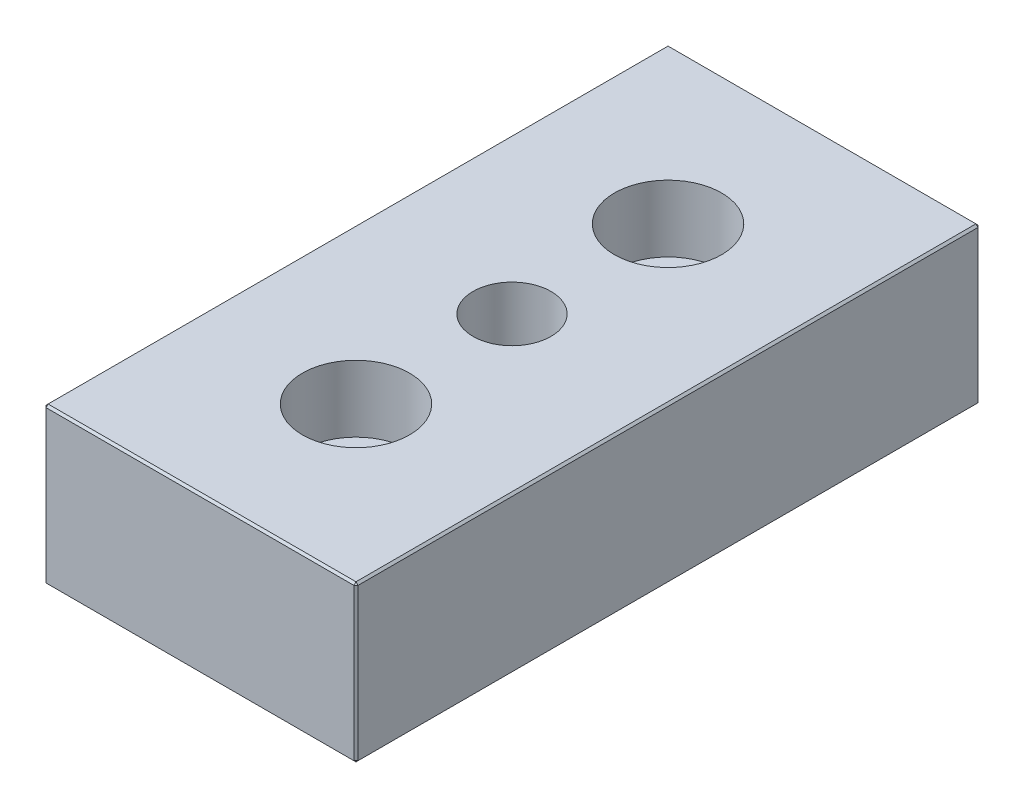
ISO-10303-21;
HEADER;
FILE_DESCRIPTION(('STEP AP214'),'2;1');
FILE_NAME('part.step','',(''),(''),'','','');
FILE_SCHEMA(('AUTOMOTIVE_DESIGN { 1 0 10303 214 1 1 1 1 }'));
ENDSEC;
DATA;
#1=APPLICATION_CONTEXT('core data for automotive mechanical design processes');
#2=APPLICATION_PROTOCOL_DEFINITION('international standard','automotive_design',2000,#1);
#3=PRODUCT_CONTEXT('',#1,'mechanical');
#4=PRODUCT('Part','Part','',(#3));
#5=PRODUCT_RELATED_PRODUCT_CATEGORY('part','',(#4));
#6=PRODUCT_DEFINITION_FORMATION('','',#4);
#7=PRODUCT_DEFINITION_CONTEXT('part definition',#1,'design');
#8=PRODUCT_DEFINITION('design','',#6,#7);
#9=PRODUCT_DEFINITION_SHAPE('','',#8);
#10=(LENGTH_UNIT() NAMED_UNIT(*) SI_UNIT(.MILLI.,.METRE.));
#11=(NAMED_UNIT(*) PLANE_ANGLE_UNIT() SI_UNIT($,.RADIAN.));
#12=(NAMED_UNIT(*) SI_UNIT($,.STERADIAN.) SOLID_ANGLE_UNIT());
#13=UNCERTAINTY_MEASURE_WITH_UNIT(LENGTH_MEASURE(1.E-05),#10,'distance_accuracy_value','');
#14=(GEOMETRIC_REPRESENTATION_CONTEXT(3) GLOBAL_UNCERTAINTY_ASSIGNED_CONTEXT((#13)) GLOBAL_UNIT_ASSIGNED_CONTEXT((#10,
#11,#12)) REPRESENTATION_CONTEXT('',''));
#15=CARTESIAN_POINT('',(0.,0.,0.));
#16=DIRECTION('',(0.,0.,1.));
#17=DIRECTION('',(1.,0.,0.));
#18=AXIS2_PLACEMENT_3D('',#15,#16,#17);
#19=CARTESIAN_POINT('',(-6.35000000000001,19.05,-19.05));
#20=DIRECTION('',(0.,-1.,0.));
#21=DIRECTION('',(0.,0.,-1.));
#22=AXIS2_PLACEMENT_3D('',#19,#20,#21);
#23=CYLINDRICAL_SURFACE('',#22,4.1656);
#24=CARTESIAN_POINT('',(-6.35000000000001,0.,-19.05));
#25=DIRECTION('',(0.,1.,0.));
#26=DIRECTION('',(0.,0.,1.));
#27=AXIS2_PLACEMENT_3D('',#24,#25,#26);
#28=CIRCLE('',#27,4.1656);
#29=CARTESIAN_POINT('',(-6.35000000000001,0.,-23.2156));
#30=VERTEX_POINT('',#29);
#31=EDGE_CURVE('E359',#30,#30,#28,.T.);
#32=CARTESIAN_POINT('',(-6.35000000000001,10.922,-19.05));
#33=DIRECTION('',(0.,1.,0.));
#34=DIRECTION('',(0.,0.,1.));
#35=AXIS2_PLACEMENT_3D('',#32,#33,#34);
#36=CIRCLE('',#35,4.1656);
#37=CARTESIAN_POINT('',(-6.35000000000001,10.922,-23.2156));
#38=VERTEX_POINT('',#37);
#39=EDGE_CURVE('E343',#38,#38,#36,.T.);
#40=CARTESIAN_POINT('',(-6.35000000000001,0.,-23.2156));
#41=CARTESIAN_POINT('',(-6.35000000000001,0.113770833333333,-23.2156));
#42=CARTESIAN_POINT('',(-6.35000000000001,0.227541666666666,-23.2156));
#43=CARTESIAN_POINT('',(-6.35000000000001,0.455083333333333,-23.2156));
#44=CARTESIAN_POINT('',(-6.35000000000001,0.568854166666666,-23.2156));
#45=CARTESIAN_POINT('',(-6.35000000000001,0.796395833333332,-23.2156));
#46=CARTESIAN_POINT('',(-6.35000000000001,0.910166666666666,-23.2156));
#47=CARTESIAN_POINT('',(-6.35000000000001,1.13770833333333,-23.2156));
#48=CARTESIAN_POINT('',(-6.35000000000001,1.25147916666667,-23.2156));
#49=CARTESIAN_POINT('',(-6.35000000000001,1.47902083333333,-23.2156));
#50=CARTESIAN_POINT('',(-6.35000000000001,1.59279166666667,-23.2156));
#51=CARTESIAN_POINT('',(-6.35000000000001,1.82033333333333,-23.2156));
#52=CARTESIAN_POINT('',(-6.35000000000001,1.93410416666667,-23.2156));
#53=CARTESIAN_POINT('',(-6.35000000000001,2.16164583333333,-23.2156));
#54=CARTESIAN_POINT('',(-6.35000000000001,2.27541666666667,-23.2156));
#55=CARTESIAN_POINT('',(-6.35000000000001,2.50295833333333,-23.2156));
#56=CARTESIAN_POINT('',(-6.35000000000001,2.61672916666667,-23.2156));
#57=CARTESIAN_POINT('',(-6.35000000000001,2.84427083333333,-23.2156));
#58=CARTESIAN_POINT('',(-6.35000000000001,2.95804166666667,-23.2156));
#59=CARTESIAN_POINT('',(-6.35000000000001,3.18558333333333,-23.2156));
#60=CARTESIAN_POINT('',(-6.35000000000001,3.29935416666667,-23.2156));
#61=CARTESIAN_POINT('',(-6.35000000000001,3.52689583333333,-23.2156));
#62=CARTESIAN_POINT('',(-6.35000000000001,3.64066666666667,-23.2156));
#63=CARTESIAN_POINT('',(-6.35000000000001,3.86820833333333,-23.2156));
#64=CARTESIAN_POINT('',(-6.35000000000001,3.98197916666667,-23.2156));
#65=CARTESIAN_POINT('',(-6.35000000000001,4.20952083333333,-23.2156));
#66=CARTESIAN_POINT('',(-6.35000000000001,4.32329166666667,-23.2156));
#67=CARTESIAN_POINT('',(-6.35000000000001,4.55083333333333,-23.2156));
#68=CARTESIAN_POINT('',(-6.35000000000001,4.66460416666667,-23.2156));
#69=CARTESIAN_POINT('',(-6.35000000000001,4.89214583333333,-23.2156));
#70=CARTESIAN_POINT('',(-6.35000000000001,5.00591666666667,-23.2156));
#71=CARTESIAN_POINT('',(-6.35000000000001,5.23345833333333,-23.2156));
#72=CARTESIAN_POINT('',(-6.35000000000001,5.34722916666667,-23.2156));
#73=CARTESIAN_POINT('',(-6.35000000000001,5.57477083333333,-23.2156));
#74=CARTESIAN_POINT('',(-6.35000000000001,5.68854166666667,-23.2156));
#75=CARTESIAN_POINT('',(-6.35000000000001,5.91608333333333,-23.2156));
#76=CARTESIAN_POINT('',(-6.35000000000001,6.02985416666666,-23.2156));
#77=CARTESIAN_POINT('',(-6.35000000000001,6.25739583333333,-23.2156));
#78=CARTESIAN_POINT('',(-6.35000000000001,6.37116666666667,-23.2156));
#79=CARTESIAN_POINT('',(-6.35000000000001,6.59870833333333,-23.2156));
#80=CARTESIAN_POINT('',(-6.35000000000001,6.71247916666667,-23.2156));
#81=CARTESIAN_POINT('',(-6.35000000000001,6.94002083333333,-23.2156));
#82=CARTESIAN_POINT('',(-6.35000000000001,7.05379166666667,-23.2156));
#83=CARTESIAN_POINT('',(-6.35000000000001,7.28133333333333,-23.2156));
#84=CARTESIAN_POINT('',(-6.35000000000001,7.39510416666667,-23.2156));
#85=CARTESIAN_POINT('',(-6.35000000000001,7.62264583333333,-23.2156));
#86=CARTESIAN_POINT('',(-6.35000000000001,7.73641666666667,-23.2156));
#87=CARTESIAN_POINT('',(-6.35000000000001,7.96395833333333,-23.2156));
#88=CARTESIAN_POINT('',(-6.35000000000001,8.07772916666667,-23.2156));
#89=CARTESIAN_POINT('',(-6.35000000000001,8.30527083333333,-23.2156));
#90=CARTESIAN_POINT('',(-6.35000000000001,8.41904166666666,-23.2156));
#91=CARTESIAN_POINT('',(-6.35000000000001,8.64658333333333,-23.2156));
#92=CARTESIAN_POINT('',(-6.35000000000001,8.76035416666666,-23.2156));
#93=CARTESIAN_POINT('',(-6.35000000000001,8.98789583333333,-23.2156));
#94=CARTESIAN_POINT('',(-6.35000000000001,9.10166666666667,-23.2156));
#95=CARTESIAN_POINT('',(-6.35000000000001,9.32920833333333,-23.2156));
#96=CARTESIAN_POINT('',(-6.35000000000001,9.44297916666667,-23.2156));
#97=CARTESIAN_POINT('',(-6.35000000000001,9.67052083333333,-23.2156));
#98=CARTESIAN_POINT('',(-6.35000000000001,9.78429166666666,-23.2156));
#99=CARTESIAN_POINT('',(-6.35000000000001,10.0118333333333,-23.2156));
#100=CARTESIAN_POINT('',(-6.35000000000001,10.1256041666667,-23.2156));
#101=CARTESIAN_POINT('',(-6.35000000000001,10.3531458333333,-23.2156));
#102=CARTESIAN_POINT('',(-6.35000000000001,10.4669166666667,-23.2156));
#103=CARTESIAN_POINT('',(-6.35000000000001,10.6944583333333,-23.2156));
#104=CARTESIAN_POINT('',(-6.35000000000001,10.8082291666667,-23.2156));
#105=CARTESIAN_POINT('',(-6.35000000000001,10.922,-23.2156));
#106=B_SPLINE_CURVE_WITH_KNOTS('',3,(#40,#41,#42,#43,#44,#45,#46,#47,#48,#49,#50,#51,#52,#53,
#54,#55,#56,#57,#58,#59,#60,#61,#62,#63,#64,#65,#66,#67,#68,#69,#70,#71,#72,#73,#74,#75,#76,#77,
#78,#79,#80,#81,#82,#83,#84,#85,#86,#87,#88,#89,#90,#91,#92,#93,#94,#95,#96,#97,#98,#99,#100,
#101,#102,#103,#104,#105),.UNSPECIFIED.,.F.,.F.,(4,2,2,2,2,2,2,2,2,2,2,2,2,2,2,2,2,2,2,2,2,2,2,
2,2,2,2,2,2,2,2,2,4),(0.,0.3413125,0.682624999999999,1.0239375,1.36525,1.7065625,2.047875,
2.3891875,2.7305,3.0718125,3.413125,3.7544375,4.09575,4.4370625,4.778375,5.1196875,5.461,
5.8023125,6.143625,6.4849375,6.82625,7.1675625,7.508875,7.8501875,8.1915,8.5328125,8.874125,
9.2154375,9.55675,9.8980625,10.239375,10.5806875,10.922),.UNSPECIFIED.);
#107=EDGE_CURVE('BSEAM46',#30,#38,#106,.T.);
#108=ORIENTED_EDGE('',*,*,#31,.F.);
#109=ORIENTED_EDGE('',*,*,#39,.T.);
#110=ORIENTED_EDGE('',*,*,#107,.T.);
#111=ORIENTED_EDGE('',*,*,#107,.F.);
#112=EDGE_LOOP('',(#108,#110,#109,#111));
#113=FACE_BOUND('',#112,.T.);
#114=ADVANCED_FACE('F46',(#113),#23,.F.);
#115=CARTESIAN_POINT('',(-6.35000000000001,19.05,-57.15));
#116=DIRECTION('',(0.,-1.,0.));
#117=DIRECTION('',(0.,0.,-1.));
#118=AXIS2_PLACEMENT_3D('',#115,#116,#117);
#119=CYLINDRICAL_SURFACE('',#118,4.1656);
#120=CARTESIAN_POINT('',(-6.35000000000001,0.,-57.15));
#121=DIRECTION('',(0.,1.,0.));
#122=DIRECTION('',(0.,0.,1.));
#123=AXIS2_PLACEMENT_3D('',#120,#121,#122);
#124=CIRCLE('',#123,4.1656);
#125=CARTESIAN_POINT('',(-6.35000000000001,0.,-61.3156));
#126=VERTEX_POINT('',#125);
#127=EDGE_CURVE('E176',#126,#126,#124,.T.);
#128=CARTESIAN_POINT('',(-6.35000000000001,10.922,-57.15));
#129=DIRECTION('',(0.,1.,0.));
#130=DIRECTION('',(0.,0.,1.));
#131=AXIS2_PLACEMENT_3D('',#128,#129,#130);
#132=CIRCLE('',#131,4.1656);
#133=CARTESIAN_POINT('',(-6.35000000000001,10.922,-61.3156));
#134=VERTEX_POINT('',#133);
#135=EDGE_CURVE('E350',#134,#134,#132,.T.);
#136=CARTESIAN_POINT('',(-6.35000000000001,0.,-61.3156));
#137=CARTESIAN_POINT('',(-6.35000000000001,0.113770833333333,-61.3156));
#138=CARTESIAN_POINT('',(-6.35000000000001,0.227541666666666,-61.3156));
#139=CARTESIAN_POINT('',(-6.35000000000001,0.455083333333333,-61.3156));
#140=CARTESIAN_POINT('',(-6.35000000000001,0.568854166666666,-61.3156));
#141=CARTESIAN_POINT('',(-6.35000000000001,0.796395833333332,-61.3156));
#142=CARTESIAN_POINT('',(-6.35000000000001,0.910166666666666,-61.3156));
#143=CARTESIAN_POINT('',(-6.35000000000001,1.13770833333333,-61.3156));
#144=CARTESIAN_POINT('',(-6.35000000000001,1.25147916666667,-61.3156));
#145=CARTESIAN_POINT('',(-6.35000000000001,1.47902083333333,-61.3156));
#146=CARTESIAN_POINT('',(-6.35000000000001,1.59279166666667,-61.3156));
#147=CARTESIAN_POINT('',(-6.35000000000001,1.82033333333333,-61.3156));
#148=CARTESIAN_POINT('',(-6.35000000000001,1.93410416666667,-61.3156));
#149=CARTESIAN_POINT('',(-6.35000000000001,2.16164583333333,-61.3156));
#150=CARTESIAN_POINT('',(-6.35000000000001,2.27541666666667,-61.3156));
#151=CARTESIAN_POINT('',(-6.35000000000001,2.50295833333333,-61.3156));
#152=CARTESIAN_POINT('',(-6.35000000000001,2.61672916666667,-61.3156));
#153=CARTESIAN_POINT('',(-6.35000000000001,2.84427083333333,-61.3156));
#154=CARTESIAN_POINT('',(-6.35000000000001,2.95804166666667,-61.3156));
#155=CARTESIAN_POINT('',(-6.35000000000001,3.18558333333333,-61.3156));
#156=CARTESIAN_POINT('',(-6.35000000000001,3.29935416666667,-61.3156));
#157=CARTESIAN_POINT('',(-6.35000000000001,3.52689583333333,-61.3156));
#158=CARTESIAN_POINT('',(-6.35000000000001,3.64066666666667,-61.3156));
#159=CARTESIAN_POINT('',(-6.35000000000001,3.86820833333333,-61.3156));
#160=CARTESIAN_POINT('',(-6.35000000000001,3.98197916666667,-61.3156));
#161=CARTESIAN_POINT('',(-6.35000000000001,4.20952083333333,-61.3156));
#162=CARTESIAN_POINT('',(-6.35000000000001,4.32329166666667,-61.3156));
#163=CARTESIAN_POINT('',(-6.35000000000001,4.55083333333333,-61.3156));
#164=CARTESIAN_POINT('',(-6.35000000000001,4.66460416666667,-61.3156));
#165=CARTESIAN_POINT('',(-6.35000000000001,4.89214583333333,-61.3156));
#166=CARTESIAN_POINT('',(-6.35000000000001,5.00591666666667,-61.3156));
#167=CARTESIAN_POINT('',(-6.35000000000001,5.23345833333333,-61.3156));
#168=CARTESIAN_POINT('',(-6.35000000000001,5.34722916666667,-61.3156));
#169=CARTESIAN_POINT('',(-6.35000000000001,5.57477083333333,-61.3156));
#170=CARTESIAN_POINT('',(-6.35000000000001,5.68854166666667,-61.3156));
#171=CARTESIAN_POINT('',(-6.35000000000001,5.91608333333333,-61.3156));
#172=CARTESIAN_POINT('',(-6.35000000000001,6.02985416666666,-61.3156));
#173=CARTESIAN_POINT('',(-6.35000000000001,6.25739583333333,-61.3156));
#174=CARTESIAN_POINT('',(-6.35000000000001,6.37116666666667,-61.3156));
#175=CARTESIAN_POINT('',(-6.35000000000001,6.59870833333333,-61.3156));
#176=CARTESIAN_POINT('',(-6.35000000000001,6.71247916666667,-61.3156));
#177=CARTESIAN_POINT('',(-6.35000000000001,6.94002083333333,-61.3156));
#178=CARTESIAN_POINT('',(-6.35000000000001,7.05379166666667,-61.3156));
#179=CARTESIAN_POINT('',(-6.35000000000001,7.28133333333333,-61.3156));
#180=CARTESIAN_POINT('',(-6.35000000000001,7.39510416666667,-61.3156));
#181=CARTESIAN_POINT('',(-6.35000000000001,7.62264583333333,-61.3156));
#182=CARTESIAN_POINT('',(-6.35000000000001,7.73641666666667,-61.3156));
#183=CARTESIAN_POINT('',(-6.35000000000001,7.96395833333333,-61.3156));
#184=CARTESIAN_POINT('',(-6.35000000000001,8.07772916666667,-61.3156));
#185=CARTESIAN_POINT('',(-6.35000000000001,8.30527083333333,-61.3156));
#186=CARTESIAN_POINT('',(-6.35000000000001,8.41904166666666,-61.3156));
#187=CARTESIAN_POINT('',(-6.35000000000001,8.64658333333333,-61.3156));
#188=CARTESIAN_POINT('',(-6.35000000000001,8.76035416666666,-61.3156));
#189=CARTESIAN_POINT('',(-6.35000000000001,8.98789583333333,-61.3156));
#190=CARTESIAN_POINT('',(-6.35000000000001,9.10166666666667,-61.3156));
#191=CARTESIAN_POINT('',(-6.35000000000001,9.32920833333333,-61.3156));
#192=CARTESIAN_POINT('',(-6.35000000000001,9.44297916666667,-61.3156));
#193=CARTESIAN_POINT('',(-6.35000000000001,9.67052083333333,-61.3156));
#194=CARTESIAN_POINT('',(-6.35000000000001,9.78429166666666,-61.3156));
#195=CARTESIAN_POINT('',(-6.35000000000001,10.0118333333333,-61.3156));
#196=CARTESIAN_POINT('',(-6.35000000000001,10.1256041666667,-61.3156));
#197=CARTESIAN_POINT('',(-6.35000000000001,10.3531458333333,-61.3156));
#198=CARTESIAN_POINT('',(-6.35000000000001,10.4669166666667,-61.3156));
#199=CARTESIAN_POINT('',(-6.35000000000001,10.6944583333333,-61.3156));
#200=CARTESIAN_POINT('',(-6.35000000000001,10.8082291666667,-61.3156));
#201=CARTESIAN_POINT('',(-6.35000000000001,10.922,-61.3156));
#202=B_SPLINE_CURVE_WITH_KNOTS('',3,(#136,#137,#138,#139,#140,#141,#142,#143,#144,#145,#146,
#147,#148,#149,#150,#151,#152,#153,#154,#155,#156,#157,#158,#159,#160,#161,#162,#163,#164,#165,
#166,#167,#168,#169,#170,#171,#172,#173,#174,#175,#176,#177,#178,#179,#180,#181,#182,#183,#184,
#185,#186,#187,#188,#189,#190,#191,#192,#193,#194,#195,#196,#197,#198,#199,#200,#201),
.UNSPECIFIED.,.F.,.F.,(4,2,2,2,2,2,2,2,2,2,2,2,2,2,2,2,2,2,2,2,2,2,2,2,2,2,2,2,2,2,2,2,4),(0.,
0.3413125,0.682624999999999,1.0239375,1.36525,1.7065625,2.047875,2.3891875,2.7305,3.0718125,
3.413125,3.7544375,4.09575,4.4370625,4.778375,5.1196875,5.461,5.8023125,6.143625,6.4849375,
6.82625,7.1675625,7.508875,7.8501875,8.1915,8.5328125,8.874125,9.2154375,9.55675,9.8980625,
10.239375,10.5806875,10.922),.UNSPECIFIED.);
#203=EDGE_CURVE('BSEAM429',#126,#134,#202,.T.);
#204=ORIENTED_EDGE('',*,*,#127,.F.);
#205=ORIENTED_EDGE('',*,*,#135,.T.);
#206=ORIENTED_EDGE('',*,*,#203,.T.);
#207=ORIENTED_EDGE('',*,*,#203,.F.);
#208=EDGE_LOOP('',(#204,#206,#205,#207));
#209=FACE_BOUND('',#208,.T.);
#210=ADVANCED_FACE('F429',(#209),#119,.F.);
#211=CARTESIAN_POINT('',(-25.4,19.05,0.));
#212=DIRECTION('',(0.,1.,0.));
#213=DIRECTION('',(0.,0.,1.));
#214=AXIS2_PLACEMENT_3D('',#211,#212,#213);
#215=PLANE('',#214);
#216=DIRECTION('',(-1.,0.,0.));
#217=VECTOR('',#216,1.);
#218=CARTESIAN_POINT('',(-25.4,19.05,-75.946));
#219=LINE('',#218,#217);
#220=CARTESIAN_POINT('',(12.446,19.05,-75.946));
#221=VERTEX_POINT('',#220);
#222=CARTESIAN_POINT('',(-25.146,19.05,-75.946));
#223=VERTEX_POINT('',#222);
#224=EDGE_CURVE('E181',#221,#223,#219,.T.);
#225=ORIENTED_EDGE('',*,*,#224,.T.);
#226=DIRECTION('',(0.,0.,1.));
#227=VECTOR('',#226,1.);
#228=CARTESIAN_POINT('',(-25.146,19.05,0.));
#229=LINE('',#228,#227);
#230=CARTESIAN_POINT('',(-25.146,19.05,-0.253999999999997));
#231=VERTEX_POINT('',#230);
#232=EDGE_CURVE('E149',#223,#231,#229,.T.);
#233=ORIENTED_EDGE('',*,*,#232,.T.);
#234=DIRECTION('',(1.,0.,0.));
#235=VECTOR('',#234,1.);
#236=CARTESIAN_POINT('',(12.7,19.05,-0.253999999999997));
#237=LINE('',#236,#235);
#238=CARTESIAN_POINT('',(12.446,19.05,-0.253999999999997));
#239=VERTEX_POINT('',#238);
#240=EDGE_CURVE('E168',#231,#239,#237,.T.);
#241=ORIENTED_EDGE('',*,*,#240,.T.);
#242=DIRECTION('',(0.,0.,-1.));
#243=VECTOR('',#242,1.);
#244=CARTESIAN_POINT('',(12.446,19.05,-76.2));
#245=LINE('',#244,#243);
#246=EDGE_CURVE('E175',#239,#221,#245,.T.);
#247=ORIENTED_EDGE('',*,*,#246,.T.);
#248=EDGE_LOOP('',(#225,#233,#241,#247));
#249=FACE_BOUND('',#248,.T.);
#250=CARTESIAN_POINT('',(-6.35000000000001,19.05,-19.05));
#251=DIRECTION('',(0.,1.,0.));
#252=DIRECTION('',(0.,0.,1.));
#253=AXIS2_PLACEMENT_3D('',#250,#251,#252);
#254=CIRCLE('',#253,6.5405);
#255=CARTESIAN_POINT('',(-6.35000000000001,19.05,-12.5095));
#256=VERTEX_POINT('',#255);
#257=EDGE_CURVE('E326',#256,#256,#254,.T.);
#258=ORIENTED_EDGE('',*,*,#257,.F.);
#259=EDGE_LOOP('',(#258));
#260=FACE_BOUND('',#259,.T.);
#261=CARTESIAN_POINT('',(-6.35000000000001,19.05,-57.15));
#262=DIRECTION('',(0.,1.,0.));
#263=DIRECTION('',(0.,0.,1.));
#264=AXIS2_PLACEMENT_3D('',#261,#262,#263);
#265=CIRCLE('',#264,6.5405);
#266=CARTESIAN_POINT('',(-6.35000000000001,19.05,-50.6095));
#267=VERTEX_POINT('',#266);
#268=EDGE_CURVE('E351',#267,#267,#265,.T.);
#269=ORIENTED_EDGE('',*,*,#268,.F.);
#270=EDGE_LOOP('',(#269));
#271=FACE_BOUND('',#270,.T.);
#272=CARTESIAN_POINT('',(-6.35000000000001,19.05,-38.1));
#273=DIRECTION('',(0.,1.,0.));
#274=DIRECTION('',(0.,0.,1.));
#275=AXIS2_PLACEMENT_3D('',#272,#273,#274);
#276=CIRCLE('',#275,4.7625);
#277=CARTESIAN_POINT('',(-6.35000000000001,19.05,-42.8625));
#278=VERTEX_POINT('',#277);
#279=EDGE_CURVE('E355',#278,#278,#276,.T.);
#280=ORIENTED_EDGE('',*,*,#279,.F.);
#281=EDGE_LOOP('',(#280));
#282=FACE_BOUND('',#281,.T.);
#283=ADVANCED_FACE('F178',(#249,#260,#271,#282),#215,.T.);
#284=CARTESIAN_POINT('',(-25.4,0.,0.));
#285=DIRECTION('',(0.,1.,0.));
#286=DIRECTION('',(0.,0.,1.));
#287=AXIS2_PLACEMENT_3D('',#284,#285,#286);
#288=PLANE('',#287);
#289=DIRECTION('',(-1.,0.,0.));
#290=VECTOR('',#289,1.);
#291=CARTESIAN_POINT('',(-25.4,0.,-0.253999999999997));
#292=LINE('',#291,#290);
#293=CARTESIAN_POINT('',(12.446,0.,-0.253999999999997));
#294=VERTEX_POINT('',#293);
#295=CARTESIAN_POINT('',(-25.146,0.,-0.253999999999997));
#296=VERTEX_POINT('',#295);
#297=EDGE_CURVE('E202',#294,#296,#292,.T.);
#298=ORIENTED_EDGE('',*,*,#297,.T.);
#299=DIRECTION('',(0.,0.,-1.));
#300=VECTOR('',#299,1.);
#301=CARTESIAN_POINT('',(-25.146,0.,0.));
#302=LINE('',#301,#300);
#303=CARTESIAN_POINT('',(-25.146,0.,-75.946));
#304=VERTEX_POINT('',#303);
#305=EDGE_CURVE('E211',#296,#304,#302,.T.);
#306=ORIENTED_EDGE('',*,*,#305,.T.);
#307=DIRECTION('',(1.,0.,0.));
#308=VECTOR('',#307,1.);
#309=CARTESIAN_POINT('',(-25.4,0.,-75.946));
#310=LINE('',#309,#308);
#311=CARTESIAN_POINT('',(12.446,0.,-75.946));
#312=VERTEX_POINT('',#311);
#313=EDGE_CURVE('E208',#304,#312,#310,.T.);
#314=ORIENTED_EDGE('',*,*,#313,.T.);
#315=DIRECTION('',(0.,0.,1.));
#316=VECTOR('',#315,1.);
#317=CARTESIAN_POINT('',(12.446,0.,0.));
#318=LINE('',#317,#316);
#319=EDGE_CURVE('E205',#312,#294,#318,.T.);
#320=ORIENTED_EDGE('',*,*,#319,.T.);
#321=EDGE_LOOP('',(#298,#306,#314,#320));
#322=FACE_BOUND('',#321,.T.);
#323=ORIENTED_EDGE('',*,*,#31,.T.);
#324=EDGE_LOOP('',(#323));
#325=FACE_BOUND('',#324,.T.);
#326=ORIENTED_EDGE('',*,*,#127,.T.);
#327=EDGE_LOOP('',(#326));
#328=FACE_BOUND('',#327,.T.);
#329=CARTESIAN_POINT('',(-6.35000000000001,0.,-38.1));
#330=DIRECTION('',(0.,1.,0.));
#331=DIRECTION('',(0.,0.,1.));
#332=AXIS2_PLACEMENT_3D('',#329,#330,#331);
#333=CIRCLE('',#332,4.7625);
#334=CARTESIAN_POINT('',(-6.35000000000001,0.,-42.8625));
#335=VERTEX_POINT('',#334);
#336=EDGE_CURVE('E360',#335,#335,#333,.T.);
#337=ORIENTED_EDGE('',*,*,#336,.T.);
#338=EDGE_LOOP('',(#337));
#339=FACE_BOUND('',#338,.T.);
#340=ADVANCED_FACE('F445',(#322,#325,#328,#339),#288,.F.);
#341=CARTESIAN_POINT('',(-25.4,19.05,-76.2));
#342=DIRECTION('',(1.,0.,0.));
#343=DIRECTION('',(0.,0.,-1.));
#344=AXIS2_PLACEMENT_3D('',#341,#342,#343);
#345=PLANE('',#344);
#346=DIRECTION('',(0.,0.,-1.));
#347=VECTOR('',#346,1.);
#348=CARTESIAN_POINT('',(-25.4,18.796,-76.2));
#349=LINE('',#348,#347);
#350=CARTESIAN_POINT('',(-25.4,18.796,-0.254000000000004));
#351=VERTEX_POINT('',#350);
#352=CARTESIAN_POINT('',(-25.4,18.796,-75.946));
#353=VERTEX_POINT('',#352);
#354=EDGE_CURVE('E151',#351,#353,#349,.T.);
#355=ORIENTED_EDGE('',*,*,#354,.T.);
#356=DIRECTION('',(0.,-1.,0.));
#357=VECTOR('',#356,1.);
#358=CARTESIAN_POINT('',(-25.4,19.05,-75.946));
#359=LINE('',#358,#357);
#360=CARTESIAN_POINT('',(-25.4,0.25399999999999,-75.946));
#361=VERTEX_POINT('',#360);
#362=EDGE_CURVE('E199',#353,#361,#359,.T.);
#363=ORIENTED_EDGE('',*,*,#362,.T.);
#364=DIRECTION('',(0.,0.,1.));
#365=VECTOR('',#364,1.);
#366=CARTESIAN_POINT('',(-25.4,0.25399999999999,-76.2));
#367=LINE('',#366,#365);
#368=CARTESIAN_POINT('',(-25.4,0.25399999999999,-0.254000000000004));
#369=VERTEX_POINT('',#368);
#370=EDGE_CURVE('E189',#361,#369,#367,.T.);
#371=ORIENTED_EDGE('',*,*,#370,.T.);
#372=DIRECTION('',(0.,1.,0.));
#373=VECTOR('',#372,1.);
#374=CARTESIAN_POINT('',(-25.4,19.05,-0.254000000000004));
#375=LINE('',#374,#373);
#376=EDGE_CURVE('E184',#369,#351,#375,.T.);
#377=ORIENTED_EDGE('',*,*,#376,.T.);
#378=EDGE_LOOP('',(#355,#363,#371,#377));
#379=FACE_BOUND('',#378,.T.);
#380=ADVANCED_FACE('F399',(#379),#345,.F.);
#381=CARTESIAN_POINT('',(-25.4,19.05,0.));
#382=DIRECTION('',(0.,0.,-1.));
#383=DIRECTION('',(-1.,0.,0.));
#384=AXIS2_PLACEMENT_3D('',#381,#382,#383);
#385=PLANE('',#384);
#386=DIRECTION('',(-1.,0.,0.));
#387=VECTOR('',#386,1.);
#388=CARTESIAN_POINT('',(-25.4,18.796,0.));
#389=LINE('',#388,#387);
#390=CARTESIAN_POINT('',(12.446,18.796,0.));
#391=VERTEX_POINT('',#390);
#392=CARTESIAN_POINT('',(-25.146,18.796,0.));
#393=VERTEX_POINT('',#392);
#394=EDGE_CURVE('E56',#391,#393,#389,.T.);
#395=ORIENTED_EDGE('',*,*,#394,.T.);
#396=DIRECTION('',(0.,-1.,0.));
#397=VECTOR('',#396,1.);
#398=CARTESIAN_POINT('',(-25.146,19.05,0.));
#399=LINE('',#398,#397);
#400=CARTESIAN_POINT('',(-25.146,0.25399999999999,0.));
#401=VERTEX_POINT('',#400);
#402=EDGE_CURVE('E11',#393,#401,#399,.T.);
#403=ORIENTED_EDGE('',*,*,#402,.T.);
#404=DIRECTION('',(1.,0.,0.));
#405=VECTOR('',#404,1.);
#406=CARTESIAN_POINT('',(-25.4,0.25399999999999,0.));
#407=LINE('',#406,#405);
#408=CARTESIAN_POINT('',(12.446,0.25399999999999,0.));
#409=VERTEX_POINT('',#408);
#410=EDGE_CURVE('E241',#401,#409,#407,.T.);
#411=ORIENTED_EDGE('',*,*,#410,.T.);
#412=DIRECTION('',(0.,1.,0.));
#413=VECTOR('',#412,1.);
#414=CARTESIAN_POINT('',(12.446,19.05,0.));
#415=LINE('',#414,#413);
#416=EDGE_CURVE('E67',#409,#391,#415,.T.);
#417=ORIENTED_EDGE('',*,*,#416,.T.);
#418=EDGE_LOOP('',(#395,#403,#411,#417));
#419=FACE_BOUND('',#418,.T.);
#420=ADVANCED_FACE('F405',(#419),#385,.F.);
#421=CARTESIAN_POINT('',(12.7,19.05,-76.2));
#422=DIRECTION('',(-1.,0.,0.));
#423=DIRECTION('',(0.,0.,1.));
#424=AXIS2_PLACEMENT_3D('',#421,#422,#423);
#425=PLANE('',#424);
#426=DIRECTION('',(0.,1.,0.));
#427=VECTOR('',#426,1.);
#428=CARTESIAN_POINT('',(12.7,19.05,-75.946));
#429=LINE('',#428,#427);
#430=CARTESIAN_POINT('',(12.7,0.25399999999999,-75.946));
#431=VERTEX_POINT('',#430);
#432=CARTESIAN_POINT('',(12.7,18.796,-75.946));
#433=VERTEX_POINT('',#432);
#434=EDGE_CURVE('E234',#431,#433,#429,.T.);
#435=ORIENTED_EDGE('',*,*,#434,.T.);
#436=DIRECTION('',(0.,0.,1.));
#437=VECTOR('',#436,1.);
#438=CARTESIAN_POINT('',(12.7,18.796,0.));
#439=LINE('',#438,#437);
#440=CARTESIAN_POINT('',(12.7,18.796,-0.254000000000004));
#441=VERTEX_POINT('',#440);
#442=EDGE_CURVE('E237',#433,#441,#439,.T.);
#443=ORIENTED_EDGE('',*,*,#442,.T.);
#444=DIRECTION('',(0.,-1.,0.));
#445=VECTOR('',#444,1.);
#446=CARTESIAN_POINT('',(12.7,19.05,-0.254000000000004));
#447=LINE('',#446,#445);
#448=CARTESIAN_POINT('',(12.7,0.25399999999999,-0.254000000000004));
#449=VERTEX_POINT('',#448);
#450=EDGE_CURVE('E228',#441,#449,#447,.T.);
#451=ORIENTED_EDGE('',*,*,#450,.T.);
#452=DIRECTION('',(0.,0.,-1.));
#453=VECTOR('',#452,1.);
#454=CARTESIAN_POINT('',(12.7,0.25399999999999,-76.2));
#455=LINE('',#454,#453);
#456=EDGE_CURVE('E231',#449,#431,#455,.T.);
#457=ORIENTED_EDGE('',*,*,#456,.T.);
#458=EDGE_LOOP('',(#435,#443,#451,#457));
#459=FACE_BOUND('',#458,.T.);
#460=ADVANCED_FACE('F452',(#459),#425,.F.);
#461=CARTESIAN_POINT('',(-25.4,19.05,-76.2));
#462=DIRECTION('',(0.,0.,1.));
#463=DIRECTION('',(1.,0.,0.));
#464=AXIS2_PLACEMENT_3D('',#461,#462,#463);
#465=PLANE('',#464);
#466=DIRECTION('',(0.,1.,0.));
#467=VECTOR('',#466,1.);
#468=CARTESIAN_POINT('',(-25.146,19.05,-76.2));
#469=LINE('',#468,#467);
#470=CARTESIAN_POINT('',(-25.146,0.25399999999999,-76.2));
#471=VERTEX_POINT('',#470);
#472=CARTESIAN_POINT('',(-25.146,18.796,-76.2));
#473=VERTEX_POINT('',#472);
#474=EDGE_CURVE('E221',#471,#473,#469,.T.);
#475=ORIENTED_EDGE('',*,*,#474,.T.);
#476=DIRECTION('',(1.,0.,0.));
#477=VECTOR('',#476,1.);
#478=CARTESIAN_POINT('',(12.7,18.796,-76.2));
#479=LINE('',#478,#477);
#480=CARTESIAN_POINT('',(12.446,18.796,-76.2));
#481=VERTEX_POINT('',#480);
#482=EDGE_CURVE('E224',#473,#481,#479,.T.);
#483=ORIENTED_EDGE('',*,*,#482,.T.);
#484=DIRECTION('',(0.,-1.,0.));
#485=VECTOR('',#484,1.);
#486=CARTESIAN_POINT('',(12.446,19.05,-76.2));
#487=LINE('',#486,#485);
#488=CARTESIAN_POINT('',(12.446,0.25399999999999,-76.2));
#489=VERTEX_POINT('',#488);
#490=EDGE_CURVE('E215',#481,#489,#487,.T.);
#491=ORIENTED_EDGE('',*,*,#490,.T.);
#492=DIRECTION('',(-1.,0.,0.));
#493=VECTOR('',#492,1.);
#494=CARTESIAN_POINT('',(-25.4,0.25399999999999,-76.2));
#495=LINE('',#494,#493);
#496=EDGE_CURVE('E218',#489,#471,#495,.T.);
#497=ORIENTED_EDGE('',*,*,#496,.T.);
#498=EDGE_LOOP('',(#475,#483,#491,#497));
#499=FACE_BOUND('',#498,.T.);
#500=ADVANCED_FACE('F449',(#499),#465,.F.);
#501=CARTESIAN_POINT('',(-6.35000000000001,19.05,-38.1));
#502=DIRECTION('',(0.,-1.,0.));
#503=DIRECTION('',(0.,0.,-1.));
#504=AXIS2_PLACEMENT_3D('',#501,#502,#503);
#505=CYLINDRICAL_SURFACE('',#504,4.7625);
#506=CARTESIAN_POINT('',(-6.35000000000001,19.05,-42.8625));
#507=CARTESIAN_POINT('',(-6.35000000000001,18.8515625,-42.8625));
#508=CARTESIAN_POINT('',(-6.35000000000001,18.653125,-42.8625));
#509=CARTESIAN_POINT('',(-6.35000000000001,18.25625,-42.8625));
#510=CARTESIAN_POINT('',(-6.35000000000001,18.0578125,-42.8625));
#511=CARTESIAN_POINT('',(-6.35000000000001,17.6609375,-42.8625));
#512=CARTESIAN_POINT('',(-6.35000000000001,17.4625,-42.8625));
#513=CARTESIAN_POINT('',(-6.35000000000001,17.065625,-42.8625));
#514=CARTESIAN_POINT('',(-6.35000000000001,16.8671875,-42.8625));
#515=CARTESIAN_POINT('',(-6.35000000000001,16.4703125,-42.8625));
#516=CARTESIAN_POINT('',(-6.35000000000001,16.271875,-42.8625));
#517=CARTESIAN_POINT('',(-6.35000000000001,15.875,-42.8625));
#518=CARTESIAN_POINT('',(-6.35000000000001,15.6765625,-42.8625));
#519=CARTESIAN_POINT('',(-6.35000000000001,15.2796875,-42.8625));
#520=CARTESIAN_POINT('',(-6.35000000000001,15.08125,-42.8625));
#521=CARTESIAN_POINT('',(-6.35000000000001,14.684375,-42.8625));
#522=CARTESIAN_POINT('',(-6.35000000000001,14.4859375,-42.8625));
#523=CARTESIAN_POINT('',(-6.35000000000001,14.0890625,-42.8625));
#524=CARTESIAN_POINT('',(-6.35000000000001,13.890625,-42.8625));
#525=CARTESIAN_POINT('',(-6.35000000000001,13.49375,-42.8625));
#526=CARTESIAN_POINT('',(-6.35000000000001,13.2953125,-42.8625));
#527=CARTESIAN_POINT('',(-6.35000000000001,12.8984375,-42.8625));
#528=CARTESIAN_POINT('',(-6.35000000000001,12.7,-42.8625));
#529=CARTESIAN_POINT('',(-6.35000000000001,12.303125,-42.8625));
#530=CARTESIAN_POINT('',(-6.35000000000001,12.1046875,-42.8625));
#531=CARTESIAN_POINT('',(-6.35000000000001,11.7078125,-42.8625));
#532=CARTESIAN_POINT('',(-6.35000000000001,11.509375,-42.8625));
#533=CARTESIAN_POINT('',(-6.35000000000001,11.1125,-42.8625));
#534=CARTESIAN_POINT('',(-6.35000000000001,10.9140625,-42.8625));
#535=CARTESIAN_POINT('',(-6.35000000000001,10.5171875,-42.8625));
#536=CARTESIAN_POINT('',(-6.35000000000001,10.31875,-42.8625));
#537=CARTESIAN_POINT('',(-6.35000000000001,9.921875,-42.8625));
#538=CARTESIAN_POINT('',(-6.35000000000001,9.7234375,-42.8625));
#539=CARTESIAN_POINT('',(-6.35000000000001,9.3265625,-42.8625));
#540=CARTESIAN_POINT('',(-6.35000000000001,9.128125,-42.8625));
#541=CARTESIAN_POINT('',(-6.35000000000001,8.73125,-42.8625));
#542=CARTESIAN_POINT('',(-6.35000000000001,8.5328125,-42.8625));
#543=CARTESIAN_POINT('',(-6.35000000000001,8.1359375,-42.8625));
#544=CARTESIAN_POINT('',(-6.35000000000001,7.9375,-42.8625));
#545=CARTESIAN_POINT('',(-6.35000000000001,7.540625,-42.8625));
#546=CARTESIAN_POINT('',(-6.35000000000001,7.3421875,-42.8625));
#547=CARTESIAN_POINT('',(-6.35000000000001,6.9453125,-42.8625));
#548=CARTESIAN_POINT('',(-6.35000000000001,6.746875,-42.8625));
#549=CARTESIAN_POINT('',(-6.35000000000001,6.35,-42.8625));
#550=CARTESIAN_POINT('',(-6.35000000000001,6.1515625,-42.8625));
#551=CARTESIAN_POINT('',(-6.35000000000001,5.7546875,-42.8625));
#552=CARTESIAN_POINT('',(-6.35000000000001,5.55625,-42.8625));
#553=CARTESIAN_POINT('',(-6.35000000000001,5.159375,-42.8625));
#554=CARTESIAN_POINT('',(-6.35000000000001,4.9609375,-42.8625));
#555=CARTESIAN_POINT('',(-6.35000000000001,4.5640625,-42.8625));
#556=CARTESIAN_POINT('',(-6.35000000000001,4.365625,-42.8625));
#557=CARTESIAN_POINT('',(-6.35000000000001,3.96875,-42.8625));
#558=CARTESIAN_POINT('',(-6.35000000000001,3.7703125,-42.8625));
#559=CARTESIAN_POINT('',(-6.35000000000001,3.3734375,-42.8625));
#560=CARTESIAN_POINT('',(-6.35000000000001,3.175,-42.8625));
#561=CARTESIAN_POINT('',(-6.35000000000001,2.778125,-42.8625));
#562=CARTESIAN_POINT('',(-6.35000000000001,2.5796875,-42.8625));
#563=CARTESIAN_POINT('',(-6.35000000000001,2.1828125,-42.8625));
#564=CARTESIAN_POINT('',(-6.35000000000001,1.984375,-42.8625));
#565=CARTESIAN_POINT('',(-6.35000000000001,1.5875,-42.8625));
#566=CARTESIAN_POINT('',(-6.35000000000001,1.3890625,-42.8625));
#567=CARTESIAN_POINT('',(-6.35000000000001,0.992187500000001,-42.8625));
#568=CARTESIAN_POINT('',(-6.35000000000001,0.793750000000001,-42.8625));
#569=CARTESIAN_POINT('',(-6.35000000000001,0.396875,-42.8625));
#570=CARTESIAN_POINT('',(-6.35000000000001,0.1984375,-42.8625));
#571=CARTESIAN_POINT('',(-6.35000000000001,0.,-42.8625));
#572=B_SPLINE_CURVE_WITH_KNOTS('',3,(#506,#507,#508,#509,#510,#511,#512,#513,#514,#515,#516,
#517,#518,#519,#520,#521,#522,#523,#524,#525,#526,#527,#528,#529,#530,#531,#532,#533,#534,#535,
#536,#537,#538,#539,#540,#541,#542,#543,#544,#545,#546,#547,#548,#549,#550,#551,#552,#553,#554,
#555,#556,#557,#558,#559,#560,#561,#562,#563,#564,#565,#566,#567,#568,#569,#570,#571),
.UNSPECIFIED.,.F.,.F.,(4,2,2,2,2,2,2,2,2,2,2,2,2,2,2,2,2,2,2,2,2,2,2,2,2,2,2,2,2,2,2,2,4),(0.,
0.5953125,1.190625,1.7859375,2.38125,2.9765625,3.571875,4.1671875,4.7625,5.3578125,5.953125,
6.5484375,7.14375,7.7390625,8.334375,8.9296875,9.525,10.1203125,10.715625,11.3109375,11.90625,
12.5015625,13.096875,13.6921875,14.2875,14.8828125,15.478125,16.0734375,16.66875,17.2640625,
17.859375,18.4546875,19.05),.UNSPECIFIED.);
#573=EDGE_CURVE('BSEAM440',#278,#335,#572,.T.);
#574=ORIENTED_EDGE('',*,*,#279,.T.);
#575=ORIENTED_EDGE('',*,*,#336,.F.);
#576=ORIENTED_EDGE('',*,*,#573,.T.);
#577=ORIENTED_EDGE('',*,*,#573,.F.);
#578=EDGE_LOOP('',(#574,#576,#575,#577));
#579=FACE_BOUND('',#578,.T.);
#580=ADVANCED_FACE('F440',(#579),#505,.F.);
#581=CARTESIAN_POINT('',(-6.35000000000001,10.922,-57.15));
#582=DIRECTION('',(0.,1.,0.));
#583=DIRECTION('',(0.,0.,1.));
#584=AXIS2_PLACEMENT_3D('',#581,#582,#583);
#585=CYLINDRICAL_SURFACE('',#584,6.5405);
#586=CARTESIAN_POINT('',(-6.35000000000001,10.922,-57.15));
#587=DIRECTION('',(0.,1.,0.));
#588=DIRECTION('',(0.,0.,1.));
#589=AXIS2_PLACEMENT_3D('',#586,#587,#588);
#590=CIRCLE('',#589,6.5405);
#591=CARTESIAN_POINT('',(-6.35000000000001,10.922,-50.6095));
#592=VERTEX_POINT('',#591);
#593=EDGE_CURVE('E346',#592,#592,#590,.T.);
#594=ORIENTED_EDGE('',*,*,#593,.F.);
#595=EDGE_LOOP('',(#594));
#596=FACE_BOUND('',#595,.T.);
#597=ORIENTED_EDGE('',*,*,#268,.T.);
#598=EDGE_LOOP('',(#597));
#599=FACE_BOUND('',#598,.T.);
#600=ADVANCED_FACE('F701',(#596,#599),#585,.F.);
#601=CARTESIAN_POINT('',(-6.35000000000001,10.922,-57.15));
#602=DIRECTION('',(0.,1.,0.));
#603=DIRECTION('',(0.,0.,1.));
#604=AXIS2_PLACEMENT_3D('',#601,#602,#603);
#605=PLANE('',#604);
#606=ORIENTED_EDGE('',*,*,#135,.F.);
#607=EDGE_LOOP('',(#606));
#608=FACE_BOUND('',#607,.T.);
#609=ORIENTED_EDGE('',*,*,#593,.T.);
#610=EDGE_LOOP('',(#609));
#611=FACE_BOUND('',#610,.T.);
#612=ADVANCED_FACE('F690',(#608,#611),#605,.T.);
#613=CARTESIAN_POINT('',(-6.35000000000001,10.922,-19.05));
#614=DIRECTION('',(0.,1.,0.));
#615=DIRECTION('',(0.,0.,1.));
#616=AXIS2_PLACEMENT_3D('',#613,#614,#615);
#617=CYLINDRICAL_SURFACE('',#616,6.5405);
#618=CARTESIAN_POINT('',(-6.35000000000001,10.922,-19.05));
#619=DIRECTION('',(0.,1.,0.));
#620=DIRECTION('',(0.,0.,1.));
#621=AXIS2_PLACEMENT_3D('',#618,#619,#620);
#622=CIRCLE('',#621,6.5405);
#623=CARTESIAN_POINT('',(-6.35000000000001,10.922,-12.5095));
#624=VERTEX_POINT('',#623);
#625=EDGE_CURVE('E334',#624,#624,#622,.T.);
#626=ORIENTED_EDGE('',*,*,#625,.F.);
#627=EDGE_LOOP('',(#626));
#628=FACE_BOUND('',#627,.T.);
#629=ORIENTED_EDGE('',*,*,#257,.T.);
#630=EDGE_LOOP('',(#629));
#631=FACE_BOUND('',#630,.T.);
#632=ADVANCED_FACE('F679',(#628,#631),#617,.F.);
#633=CARTESIAN_POINT('',(-6.35000000000001,10.922,-19.05));
#634=DIRECTION('',(0.,1.,0.));
#635=DIRECTION('',(0.,0.,1.));
#636=AXIS2_PLACEMENT_3D('',#633,#634,#635);
#637=PLANE('',#636);
#638=ORIENTED_EDGE('',*,*,#39,.F.);
#639=EDGE_LOOP('',(#638));
#640=FACE_BOUND('',#639,.T.);
#641=ORIENTED_EDGE('',*,*,#625,.T.);
#642=EDGE_LOOP('',(#641));
#643=FACE_BOUND('',#642,.T.);
#644=ADVANCED_FACE('F626',(#640,#643),#637,.T.);
#645=CARTESIAN_POINT('',(12.7,0.25399999999999,-76.2));
#646=DIRECTION('',(-0.707106781186538,0.707106781186557,0.));
#647=DIRECTION('',(-0.707106781186557,-0.707106781186538,0.));
#648=AXIS2_PLACEMENT_3D('',#645,#646,#647);
#649=PLANE('',#648);
#650=DIRECTION('',(0.707106781186557,0.707106781186538,0.));
#651=VECTOR('',#650,1.);
#652=CARTESIAN_POINT('',(12.446,0.,-75.946));
#653=LINE('',#652,#651);
#654=EDGE_CURVE('E50',#431,#312,#653,.F.);
#655=ORIENTED_EDGE('',*,*,#654,.F.);
#656=ORIENTED_EDGE('',*,*,#456,.F.);
#657=DIRECTION('',(-0.707106781186557,-0.707106781186538,0.));
#658=VECTOR('',#657,1.);
#659=CARTESIAN_POINT('',(12.446,0.,-0.253999999999997));
#660=LINE('',#659,#658);
#661=EDGE_CURVE('E316',#294,#449,#660,.F.);
#662=ORIENTED_EDGE('',*,*,#661,.F.);
#663=ORIENTED_EDGE('',*,*,#319,.F.);
#664=EDGE_LOOP('',(#655,#656,#662,#663));
#665=FACE_BOUND('',#664,.T.);
#666=ADVANCED_FACE('F48',(#665),#649,.F.);
#667=CARTESIAN_POINT('',(12.446,0.,-75.946));
#668=DIRECTION('',(0.577350269189615,-0.577350269189631,-0.577350269189631));
#669=DIRECTION('',(0.,0.707106781186548,-0.707106781186548));
#670=AXIS2_PLACEMENT_3D('',#667,#668,#669);
#671=PLANE('',#670);
#672=DIRECTION('',(-0.707106781186557,0.,-0.707106781186538));
#673=VECTOR('',#672,1.);
#674=CARTESIAN_POINT('',(12.573,0.25399999999999,-76.073));
#675=LINE('',#674,#673);
#676=EDGE_CURVE('E309',#431,#489,#675,.T.);
#677=ORIENTED_EDGE('',*,*,#676,.F.);
#678=ORIENTED_EDGE('',*,*,#654,.T.);
#679=DIRECTION('',(0.,-0.707106781186547,0.707106781186547));
#680=VECTOR('',#679,1.);
#681=CARTESIAN_POINT('',(12.446,0.,-75.946));
#682=LINE('',#681,#680);
#683=EDGE_CURVE('E313',#489,#312,#682,.T.);
#684=ORIENTED_EDGE('',*,*,#683,.F.);
#685=EDGE_LOOP('',(#677,#678,#684));
#686=FACE_BOUND('',#685,.T.);
#687=ADVANCED_FACE('F610',(#686),#671,.T.);
#688=CARTESIAN_POINT('',(12.446,0.,-0.253999999999997));
#689=DIRECTION('',(0.577350269189636,-0.577350269189636,0.577350269189605));
#690=DIRECTION('',(0.707106781186547,0.707106781186548,0.));
#691=AXIS2_PLACEMENT_3D('',#688,#689,#690);
#692=PLANE('',#691);
#693=DIRECTION('',(0.,0.707106781186538,0.707106781186557));
#694=VECTOR('',#693,1.);
#695=CARTESIAN_POINT('',(12.446,0.,-0.253999999999997));
#696=LINE('',#695,#694);
#697=EDGE_CURVE('E301',#294,#409,#696,.T.);
#698=ORIENTED_EDGE('',*,*,#697,.F.);
#699=ORIENTED_EDGE('',*,*,#661,.T.);
#700=DIRECTION('',(0.707106781186528,0.,-0.707106781186567));
#701=VECTOR('',#700,1.);
#702=CARTESIAN_POINT('',(12.573,0.25399999999999,-0.127000000000002));
#703=LINE('',#702,#701);
#704=EDGE_CURVE('E305',#409,#449,#703,.T.);
#705=ORIENTED_EDGE('',*,*,#704,.F.);
#706=EDGE_LOOP('',(#698,#699,#705));
#707=FACE_BOUND('',#706,.T.);
#708=ADVANCED_FACE('F411',(#707),#692,.T.);
#709=CARTESIAN_POINT('',(-25.4,0.25399999999999,-76.2));
#710=DIRECTION('',(0.,0.707106781186547,0.707106781186547));
#711=DIRECTION('',(0.,-0.707106781186548,0.707106781186548));
#712=AXIS2_PLACEMENT_3D('',#709,#710,#711);
#713=PLANE('',#712);
#714=ORIENTED_EDGE('',*,*,#683,.T.);
#715=ORIENTED_EDGE('',*,*,#313,.F.);
#716=DIRECTION('',(0.,0.707106781186547,-0.707106781186547));
#717=VECTOR('',#716,1.);
#718=CARTESIAN_POINT('',(-25.146,0.,-75.946));
#719=LINE('',#718,#717);
#720=EDGE_CURVE('E294',#471,#304,#719,.F.);
#721=ORIENTED_EDGE('',*,*,#720,.F.);
#722=ORIENTED_EDGE('',*,*,#496,.F.);
#723=EDGE_LOOP('',(#714,#715,#721,#722));
#724=FACE_BOUND('',#723,.T.);
#725=ADVANCED_FACE('F591',(#724),#713,.F.);
#726=CARTESIAN_POINT('',(12.446,19.05,-76.2));
#727=DIRECTION('',(-0.707106781186538,0.,0.707106781186557));
#728=DIRECTION('',(0.707106781186557,0.,0.707106781186538));
#729=AXIS2_PLACEMENT_3D('',#726,#727,#728);
#730=PLANE('',#729);
#731=ORIENTED_EDGE('',*,*,#676,.T.);
#732=ORIENTED_EDGE('',*,*,#490,.F.);
#733=DIRECTION('',(0.707106781186557,0.,0.707106781186538));
#734=VECTOR('',#733,1.);
#735=CARTESIAN_POINT('',(12.446,18.796,-76.2));
#736=LINE('',#735,#734);
#737=EDGE_CURVE('E290',#433,#481,#736,.F.);
#738=ORIENTED_EDGE('',*,*,#737,.F.);
#739=ORIENTED_EDGE('',*,*,#434,.F.);
#740=EDGE_LOOP('',(#731,#732,#738,#739));
#741=FACE_BOUND('',#740,.T.);
#742=ADVANCED_FACE('F582',(#741),#730,.F.);
#743=CARTESIAN_POINT('',(12.446,19.05,0.));
#744=DIRECTION('',(0.707106781186567,0.707106781186528,0.));
#745=DIRECTION('',(-0.707106781186528,0.707106781186567,0.));
#746=AXIS2_PLACEMENT_3D('',#743,#744,#745);
#747=PLANE('',#746);
#748=DIRECTION('',(-0.707106781186528,0.707106781186567,0.));
#749=VECTOR('',#748,1.);
#750=CARTESIAN_POINT('',(12.7,18.796,-0.254000000000004));
#751=LINE('',#750,#749);
#752=EDGE_CURVE('E282',#441,#239,#751,.T.);
#753=ORIENTED_EDGE('',*,*,#752,.F.);
#754=ORIENTED_EDGE('',*,*,#442,.F.);
#755=DIRECTION('',(0.707106781186528,-0.707106781186567,0.));
#756=VECTOR('',#755,1.);
#757=CARTESIAN_POINT('',(12.573,18.923,-75.946));
#758=LINE('',#757,#756);
#759=EDGE_CURVE('E286',#221,#433,#758,.T.);
#760=ORIENTED_EDGE('',*,*,#759,.F.);
#761=ORIENTED_EDGE('',*,*,#246,.F.);
#762=EDGE_LOOP('',(#753,#754,#760,#761));
#763=FACE_BOUND('',#762,.T.);
#764=ADVANCED_FACE('F380',(#763),#747,.T.);
#765=CARTESIAN_POINT('',(12.7,19.05,-0.254000000000004));
#766=DIRECTION('',(-0.707106781186567,0.,-0.707106781186528));
#767=DIRECTION('',(-0.707106781186528,0.,0.707106781186567));
#768=AXIS2_PLACEMENT_3D('',#765,#766,#767);
#769=PLANE('',#768);
#770=ORIENTED_EDGE('',*,*,#704,.T.);
#771=ORIENTED_EDGE('',*,*,#450,.F.);
#772=DIRECTION('',(-0.707106781186528,0.,0.707106781186567));
#773=VECTOR('',#772,1.);
#774=CARTESIAN_POINT('',(12.7,18.796,-0.254000000000004));
#775=LINE('',#774,#773);
#776=EDGE_CURVE('E279',#391,#441,#775,.F.);
#777=ORIENTED_EDGE('',*,*,#776,.F.);
#778=ORIENTED_EDGE('',*,*,#416,.F.);
#779=EDGE_LOOP('',(#770,#771,#777,#778));
#780=FACE_BOUND('',#779,.T.);
#781=ADVANCED_FACE('F414',(#780),#769,.F.);
#782=CARTESIAN_POINT('',(-25.4,0.25399999999999,0.));
#783=DIRECTION('',(0.,0.707106781186557,-0.707106781186538));
#784=DIRECTION('',(0.,0.707106781186538,0.707106781186557));
#785=AXIS2_PLACEMENT_3D('',#782,#783,#784);
#786=PLANE('',#785);
#787=ORIENTED_EDGE('',*,*,#697,.T.);
#788=ORIENTED_EDGE('',*,*,#410,.F.);
#789=DIRECTION('',(0.,-0.707106781186538,-0.707106781186557));
#790=VECTOR('',#789,1.);
#791=CARTESIAN_POINT('',(-25.146,0.126999999999992,-0.127000000000002));
#792=LINE('',#791,#790);
#793=EDGE_CURVE('E275',#296,#401,#792,.F.);
#794=ORIENTED_EDGE('',*,*,#793,.F.);
#795=ORIENTED_EDGE('',*,*,#297,.F.);
#796=EDGE_LOOP('',(#787,#788,#794,#795));
#797=FACE_BOUND('',#796,.T.);
#798=ADVANCED_FACE('F410',(#797),#786,.F.);
#799=CARTESIAN_POINT('',(-25.4,0.25399999999999,-76.2));
#800=DIRECTION('',(0.707106781186538,0.707106781186557,0.));
#801=DIRECTION('',(-0.707106781186557,0.707106781186538,0.));
#802=AXIS2_PLACEMENT_3D('',#799,#800,#801);
#803=PLANE('',#802);
#804=DIRECTION('',(0.707106781186557,-0.707106781186538,0.));
#805=VECTOR('',#804,1.);
#806=CARTESIAN_POINT('',(-25.146,0.,-75.946));
#807=LINE('',#806,#805);
#808=EDGE_CURVE('E297',#304,#361,#807,.F.);
#809=ORIENTED_EDGE('',*,*,#808,.F.);
#810=ORIENTED_EDGE('',*,*,#305,.F.);
#811=DIRECTION('',(-0.707106781186557,0.707106781186538,0.));
#812=VECTOR('',#811,1.);
#813=CARTESIAN_POINT('',(-25.4,0.25399999999999,-0.254000000000004));
#814=LINE('',#813,#812);
#815=EDGE_CURVE('E271',#369,#296,#814,.F.);
#816=ORIENTED_EDGE('',*,*,#815,.F.);
#817=ORIENTED_EDGE('',*,*,#370,.F.);
#818=EDGE_LOOP('',(#809,#810,#816,#817));
#819=FACE_BOUND('',#818,.T.);
#820=ADVANCED_FACE('F547',(#819),#803,.F.);
#821=CARTESIAN_POINT('',(-25.146,0.,-75.946));
#822=DIRECTION('',(-0.577350269189615,-0.577350269189631,-0.577350269189631));
#823=DIRECTION('',(0.,0.707106781186548,-0.707106781186548));
#824=AXIS2_PLACEMENT_3D('',#821,#822,#823);
#825=PLANE('',#824);
#826=ORIENTED_EDGE('',*,*,#720,.T.);
#827=ORIENTED_EDGE('',*,*,#808,.T.);
#828=DIRECTION('',(-0.707106781186557,0.,0.707106781186538));
#829=VECTOR('',#828,1.);
#830=CARTESIAN_POINT('',(-25.273,0.25399999999999,-76.073));
#831=LINE('',#830,#829);
#832=EDGE_CURVE('E267',#471,#361,#831,.T.);
#833=ORIENTED_EDGE('',*,*,#832,.F.);
#834=EDGE_LOOP('',(#826,#827,#833));
#835=FACE_BOUND('',#834,.T.);
#836=ADVANCED_FACE('F426',(#835),#825,.T.);
#837=CARTESIAN_POINT('',(12.446,18.796,-76.2));
#838=DIRECTION('',(0.577350269189631,0.5773502691896,-0.577350269189647));
#839=DIRECTION('',(-0.707106781186557,0.,-0.707106781186538));
#840=AXIS2_PLACEMENT_3D('',#837,#838,#839);
#841=PLANE('',#840);
#842=ORIENTED_EDGE('',*,*,#759,.T.);
#843=ORIENTED_EDGE('',*,*,#737,.T.);
#844=DIRECTION('',(0.,0.707106781186557,0.707106781186538));
#845=VECTOR('',#844,1.);
#846=CARTESIAN_POINT('',(12.446,18.796,-76.2));
#847=LINE('',#846,#845);
#848=EDGE_CURVE('E264',#221,#481,#847,.F.);
#849=ORIENTED_EDGE('',*,*,#848,.F.);
#850=EDGE_LOOP('',(#842,#843,#849));
#851=FACE_BOUND('',#850,.T.);
#852=ADVANCED_FACE('F383',(#851),#841,.T.);
#853=CARTESIAN_POINT('',(12.7,18.796,-0.254000000000004));
#854=DIRECTION('',(0.577350269189657,0.57735026918961,0.57735026918961));
#855=DIRECTION('',(0.707106781186519,0.,-0.707106781186576));
#856=AXIS2_PLACEMENT_3D('',#853,#854,#855);
#857=PLANE('',#856);
#858=ORIENTED_EDGE('',*,*,#776,.T.);
#859=ORIENTED_EDGE('',*,*,#752,.T.);
#860=DIRECTION('',(0.,-0.707106781186538,0.707106781186557));
#861=VECTOR('',#860,1.);
#862=CARTESIAN_POINT('',(12.446,18.923,-0.127000000000005));
#863=LINE('',#862,#861);
#864=EDGE_CURVE('E171',#391,#239,#863,.F.);
#865=ORIENTED_EDGE('',*,*,#864,.F.);
#866=EDGE_LOOP('',(#858,#859,#865));
#867=FACE_BOUND('',#866,.T.);
#868=ADVANCED_FACE('F416',(#867),#857,.T.);
#869=CARTESIAN_POINT('',(-25.4,0.25399999999999,-0.254000000000004));
#870=DIRECTION('',(-0.577350269189636,-0.577350269189636,0.577350269189605));
#871=DIRECTION('',(0.707106781186547,-0.707106781186548,0.));
#872=AXIS2_PLACEMENT_3D('',#869,#870,#871);
#873=PLANE('',#872);
#874=ORIENTED_EDGE('',*,*,#815,.T.);
#875=ORIENTED_EDGE('',*,*,#793,.T.);
#876=DIRECTION('',(0.707106781186528,0.,0.707106781186567));
#877=VECTOR('',#876,1.);
#878=CARTESIAN_POINT('',(-25.4,0.25399999999999,-0.254000000000004));
#879=LINE('',#878,#877);
#880=EDGE_CURVE('E259',#369,#401,#879,.T.);
#881=ORIENTED_EDGE('',*,*,#880,.F.);
#882=EDGE_LOOP('',(#874,#875,#881));
#883=FACE_BOUND('',#882,.T.);
#884=ADVANCED_FACE('F418',(#883),#873,.T.);
#885=CARTESIAN_POINT('',(-25.4,19.05,-75.946));
#886=DIRECTION('',(0.707106781186538,0.,0.707106781186557));
#887=DIRECTION('',(0.707106781186557,0.,-0.707106781186538));
#888=AXIS2_PLACEMENT_3D('',#885,#886,#887);
#889=PLANE('',#888);
#890=ORIENTED_EDGE('',*,*,#832,.T.);
#891=ORIENTED_EDGE('',*,*,#362,.F.);
#892=DIRECTION('',(0.707106781186557,0.,-0.707106781186538));
#893=VECTOR('',#892,1.);
#894=CARTESIAN_POINT('',(-25.4,18.796,-75.946));
#895=LINE('',#894,#893);
#896=EDGE_CURVE('E255',#473,#353,#895,.F.);
#897=ORIENTED_EDGE('',*,*,#896,.F.);
#898=ORIENTED_EDGE('',*,*,#474,.F.);
#899=EDGE_LOOP('',(#890,#891,#897,#898));
#900=FACE_BOUND('',#899,.T.);
#901=ADVANCED_FACE('F395',(#900),#889,.F.);
#902=CARTESIAN_POINT('',(-25.4,19.05,-75.946));
#903=DIRECTION('',(0.,0.707106781186538,-0.707106781186557));
#904=DIRECTION('',(0.,0.707106781186557,0.707106781186538));
#905=AXIS2_PLACEMENT_3D('',#902,#903,#904);
#906=PLANE('',#905);
#907=ORIENTED_EDGE('',*,*,#848,.T.);
#908=ORIENTED_EDGE('',*,*,#482,.F.);
#909=DIRECTION('',(0.,-0.707106781186557,-0.707106781186538));
#910=VECTOR('',#909,1.);
#911=CARTESIAN_POINT('',(-25.146,18.923,-76.073));
#912=LINE('',#911,#910);
#913=EDGE_CURVE('E165',#223,#473,#912,.T.);
#914=ORIENTED_EDGE('',*,*,#913,.F.);
#915=ORIENTED_EDGE('',*,*,#224,.F.);
#916=EDGE_LOOP('',(#907,#908,#914,#915));
#917=FACE_BOUND('',#916,.T.);
#918=ADVANCED_FACE('F387',(#917),#906,.T.);
#919=CARTESIAN_POINT('',(-25.4,19.05,-0.253999999999997));
#920=DIRECTION('',(0.,0.707106781186557,0.707106781186538));
#921=DIRECTION('',(0.,-0.707106781186538,0.707106781186557));
#922=AXIS2_PLACEMENT_3D('',#919,#920,#921);
#923=PLANE('',#922);
#924=ORIENTED_EDGE('',*,*,#864,.T.);
#925=ORIENTED_EDGE('',*,*,#240,.F.);
#926=DIRECTION('',(0.,0.707106781186538,-0.707106781186557));
#927=VECTOR('',#926,1.);
#928=CARTESIAN_POINT('',(-25.146,19.05,-0.253999999999997));
#929=LINE('',#928,#927);
#930=EDGE_CURVE('E158',#393,#231,#929,.T.);
#931=ORIENTED_EDGE('',*,*,#930,.F.);
#932=ORIENTED_EDGE('',*,*,#394,.F.);
#933=EDGE_LOOP('',(#924,#925,#931,#932));
#934=FACE_BOUND('',#933,.T.);
#935=ADVANCED_FACE('F169',(#934),#923,.T.);
#936=CARTESIAN_POINT('',(-25.146,19.05,0.));
#937=DIRECTION('',(0.707106781186567,0.,-0.707106781186528));
#938=DIRECTION('',(-0.707106781186528,0.,-0.707106781186567));
#939=AXIS2_PLACEMENT_3D('',#936,#937,#938);
#940=PLANE('',#939);
#941=ORIENTED_EDGE('',*,*,#880,.T.);
#942=ORIENTED_EDGE('',*,*,#402,.F.);
#943=DIRECTION('',(-0.707106781186528,0.,-0.707106781186567));
#944=VECTOR('',#943,1.);
#945=CARTESIAN_POINT('',(-25.273,18.796,-0.127000000000002));
#946=LINE('',#945,#944);
#947=EDGE_CURVE('E162',#351,#393,#946,.F.);
#948=ORIENTED_EDGE('',*,*,#947,.F.);
#949=ORIENTED_EDGE('',*,*,#376,.F.);
#950=EDGE_LOOP('',(#941,#942,#948,#949));
#951=FACE_BOUND('',#950,.T.);
#952=ADVANCED_FACE('F403',(#951),#940,.F.);
#953=CARTESIAN_POINT('',(-25.4,18.796,-75.946));
#954=DIRECTION('',(-0.577350269189626,0.57735026918961,-0.577350269189641));
#955=DIRECTION('',(-0.707106781186557,0.,0.707106781186538));
#956=AXIS2_PLACEMENT_3D('',#953,#954,#955);
#957=PLANE('',#956);
#958=ORIENTED_EDGE('',*,*,#913,.T.);
#959=ORIENTED_EDGE('',*,*,#896,.T.);
#960=DIRECTION('',(0.707106781186538,0.707106781186557,0.));
#961=VECTOR('',#960,1.);
#962=CARTESIAN_POINT('',(-25.4,18.796,-75.946));
#963=LINE('',#962,#961);
#964=EDGE_CURVE('E155',#223,#353,#963,.F.);
#965=ORIENTED_EDGE('',*,*,#964,.F.);
#966=EDGE_LOOP('',(#958,#959,#965));
#967=FACE_BOUND('',#966,.T.);
#968=ADVANCED_FACE('F391',(#967),#957,.T.);
#969=CARTESIAN_POINT('',(-25.146,19.05,-0.253999999999997));
#970=DIRECTION('',(-0.577350269189652,0.57735026918962,0.577350269189605));
#971=DIRECTION('',(-0.707106781186528,-0.707106781186567,0.));
#972=AXIS2_PLACEMENT_3D('',#969,#970,#971);
#973=PLANE('',#972);
#974=ORIENTED_EDGE('',*,*,#947,.T.);
#975=ORIENTED_EDGE('',*,*,#930,.T.);
#976=DIRECTION('',(-0.707106781186538,-0.707106781186557,0.));
#977=VECTOR('',#976,1.);
#978=CARTESIAN_POINT('',(-25.146,19.05,-0.253999999999997));
#979=LINE('',#978,#977);
#980=EDGE_CURVE('E145',#351,#231,#979,.F.);
#981=ORIENTED_EDGE('',*,*,#980,.F.);
#982=EDGE_LOOP('',(#974,#975,#981));
#983=FACE_BOUND('',#982,.T.);
#984=ADVANCED_FACE('F160',(#983),#973,.T.);
#985=CARTESIAN_POINT('',(-25.146,19.05,0.));
#986=DIRECTION('',(-0.707106781186557,0.707106781186538,0.));
#987=DIRECTION('',(-0.707106781186538,-0.707106781186557,0.));
#988=AXIS2_PLACEMENT_3D('',#985,#986,#987);
#989=PLANE('',#988);
#990=ORIENTED_EDGE('',*,*,#964,.T.);
#991=ORIENTED_EDGE('',*,*,#354,.F.);
#992=ORIENTED_EDGE('',*,*,#980,.T.);
#993=ORIENTED_EDGE('',*,*,#232,.F.);
#994=EDGE_LOOP('',(#990,#991,#992,#993));
#995=FACE_BOUND('',#994,.T.);
#996=ADVANCED_FACE('F147',(#995),#989,.T.);
#997=CLOSED_SHELL('',(#114,#210,#283,#340,#380,#420,#460,#500,#580,#600,#612,#632,#644,#666,
#687,#708,#725,#742,#764,#781,#798,#820,#836,#852,#868,#884,#901,#918,#935,#952,#968,#984,#996));
#998=MANIFOLD_SOLID_BREP('B2',#997);
#999=ADVANCED_BREP_SHAPE_REPRESENTATION('',(#18,#998),#14);
#1000=SHAPE_DEFINITION_REPRESENTATION(#9,#999);
ENDSEC;
END-ISO-10303-21;
